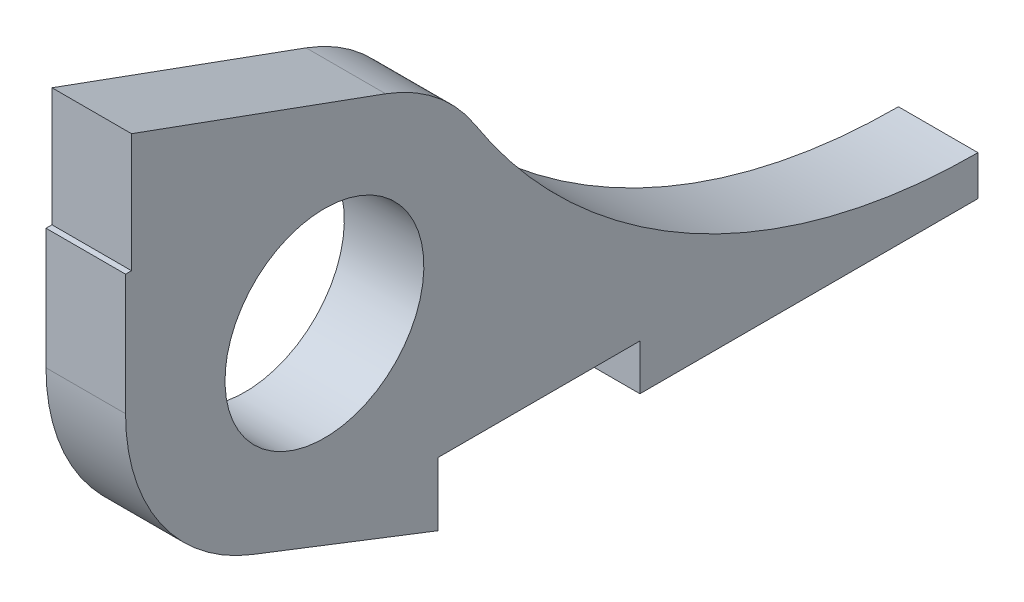
ISO-10303-21;
HEADER;
FILE_DESCRIPTION(('STEP AP214'),'2;1');
FILE_NAME('part.step','',(''),(''),'','','');
FILE_SCHEMA(('AUTOMOTIVE_DESIGN { 1 0 10303 214 1 1 1 1 }'));
ENDSEC;
DATA;
#1=APPLICATION_CONTEXT('core data for automotive mechanical design processes');
#2=APPLICATION_PROTOCOL_DEFINITION('international standard','automotive_design',2000,#1);
#3=PRODUCT_CONTEXT('',#1,'mechanical');
#4=PRODUCT('Part','Part','',(#3));
#5=PRODUCT_RELATED_PRODUCT_CATEGORY('part','',(#4));
#6=PRODUCT_DEFINITION_FORMATION('','',#4);
#7=PRODUCT_DEFINITION_CONTEXT('part definition',#1,'design');
#8=PRODUCT_DEFINITION('design','',#6,#7);
#9=PRODUCT_DEFINITION_SHAPE('','',#8);
#10=(LENGTH_UNIT() NAMED_UNIT(*) SI_UNIT(.MILLI.,.METRE.));
#11=(NAMED_UNIT(*) PLANE_ANGLE_UNIT() SI_UNIT($,.RADIAN.));
#12=(NAMED_UNIT(*) SI_UNIT($,.STERADIAN.) SOLID_ANGLE_UNIT());
#13=UNCERTAINTY_MEASURE_WITH_UNIT(LENGTH_MEASURE(1.E-05),#10,'distance_accuracy_value','');
#14=(GEOMETRIC_REPRESENTATION_CONTEXT(3) GLOBAL_UNCERTAINTY_ASSIGNED_CONTEXT((#13)) GLOBAL_UNIT_ASSIGNED_CONTEXT((#10,
#11,#12)) REPRESENTATION_CONTEXT('',''));
#15=CARTESIAN_POINT('',(0.,0.,0.));
#16=DIRECTION('',(0.,0.,1.));
#17=DIRECTION('',(1.,0.,0.));
#18=AXIS2_PLACEMENT_3D('',#15,#16,#17);
#19=CARTESIAN_POINT('',(195.3,3.3,-14.8633534503092));
#20=DIRECTION('',(0.,0.,-1.));
#21=DIRECTION('',(-1.,0.,0.));
#22=AXIS2_PLACEMENT_3D('',#19,#20,#21);
#23=PLANE('',#22);
#24=DIRECTION('',(0.,-1.,0.));
#25=VECTOR('',#24,1.);
#26=CARTESIAN_POINT('',(195.3,3.3,-14.8633534503092));
#27=LINE('',#26,#25);
#28=CARTESIAN_POINT('',(195.3,3.00000000000068,-14.8633534503092));
#29=VERTEX_POINT('',#28);
#30=CARTESIAN_POINT('',(195.3,1.,-14.8633534503092));
#31=VERTEX_POINT('',#30);
#32=EDGE_CURVE('E149',#29,#31,#27,.T.);
#33=ORIENTED_EDGE('',*,*,#32,.T.);
#34=DIRECTION('',(1.,0.,0.));
#35=VECTOR('',#34,1.);
#36=CARTESIAN_POINT('',(191.3,1.,-14.8633534503092));
#37=LINE('',#36,#35);
#38=CARTESIAN_POINT('',(191.3,1.,-14.8633534503092));
#39=VERTEX_POINT('',#38);
#40=EDGE_CURVE('E138',#39,#31,#37,.T.);
#41=ORIENTED_EDGE('',*,*,#40,.F.);
#42=DIRECTION('',(0.,-1.,0.));
#43=VECTOR('',#42,1.);
#44=CARTESIAN_POINT('',(191.3,3.3,-14.8633534503092));
#45=LINE('',#44,#43);
#46=CARTESIAN_POINT('',(191.3,3.00000000000067,-14.8633534503092));
#47=VERTEX_POINT('',#46);
#48=EDGE_CURVE('E146',#47,#39,#45,.T.);
#49=ORIENTED_EDGE('',*,*,#48,.F.);
#50=DIRECTION('',(1.,0.,0.));
#51=VECTOR('',#50,1.);
#52=CARTESIAN_POINT('',(191.3,3.00000000000067,-14.8633534503092));
#53=LINE('',#52,#51);
#54=EDGE_CURVE('E168',#47,#29,#53,.T.);
#55=ORIENTED_EDGE('',*,*,#54,.T.);
#56=EDGE_LOOP('',(#33,#41,#49,#55));
#57=FACE_BOUND('',#56,.T.);
#58=ADVANCED_FACE('F35',(#57),#23,.T.);
#59=CARTESIAN_POINT('',(195.3,3.3,2.13664654969081));
#60=DIRECTION('',(0.,0.,1.));
#61=DIRECTION('',(1.,0.,0.));
#62=AXIS2_PLACEMENT_3D('',#59,#60,#61);
#63=PLANE('',#62);
#64=DIRECTION('',(0.,-1.,0.));
#65=VECTOR('',#64,1.);
#66=CARTESIAN_POINT('',(191.3,3.3,2.13664654969081));
#67=LINE('',#66,#65);
#68=CARTESIAN_POINT('',(191.3,3.3,2.13664654969081));
#69=VERTEX_POINT('',#68);
#70=CARTESIAN_POINT('',(191.3,0.999999999999999,2.13664654969081));
#71=VERTEX_POINT('',#70);
#72=EDGE_CURVE('E165',#69,#71,#67,.T.);
#73=ORIENTED_EDGE('',*,*,#72,.T.);
#74=DIRECTION('',(-1.,0.,0.));
#75=VECTOR('',#74,1.);
#76=CARTESIAN_POINT('',(195.3,1.,2.13664654969081));
#77=LINE('',#76,#75);
#78=CARTESIAN_POINT('',(195.3,1.,2.13664654969081));
#79=VERTEX_POINT('',#78);
#80=EDGE_CURVE('E51',#79,#71,#77,.T.);
#81=ORIENTED_EDGE('',*,*,#80,.F.);
#82=DIRECTION('',(0.,-1.,0.));
#83=VECTOR('',#82,1.);
#84=CARTESIAN_POINT('',(195.3,3.3,2.13664654969081));
#85=LINE('',#84,#83);
#86=CARTESIAN_POINT('',(195.3,3.3,2.13664654969081));
#87=VERTEX_POINT('',#86);
#88=EDGE_CURVE('E201',#87,#79,#85,.T.);
#89=ORIENTED_EDGE('',*,*,#88,.F.);
#90=DIRECTION('',(-1.,0.,0.));
#91=VECTOR('',#90,1.);
#92=CARTESIAN_POINT('',(195.3,3.3,2.13664654969081));
#93=LINE('',#92,#91);
#94=EDGE_CURVE('E170',#87,#69,#93,.T.);
#95=ORIENTED_EDGE('',*,*,#94,.T.);
#96=EDGE_LOOP('',(#73,#81,#89,#95));
#97=FACE_BOUND('',#96,.T.);
#98=ADVANCED_FACE('F247',(#97),#63,.T.);
#99=CARTESIAN_POINT('',(195.3,13.0641777724765,18.0000000000002));
#100=DIRECTION('',(-1.,0.,0.));
#101=DIRECTION('',(0.,-1.,0.));
#102=AXIS2_PLACEMENT_3D('',#99,#100,#101);
#103=PLANE('',#102);
#104=CARTESIAN_POINT('',(195.3,12.0000000000007,18.));
#105=DIRECTION('',(1.,0.,0.));
#106=DIRECTION('',(0.,1.,0.));
#107=AXIS2_PLACEMENT_3D('',#104,#105,#106);
#108=CIRCLE('',#107,5.);
#109=CARTESIAN_POINT('',(195.3,17.0000000000007,18.));
#110=VERTEX_POINT('',#109);
#111=EDGE_CURVE('E217',#110,#110,#108,.T.);
#112=ORIENTED_EDGE('',*,*,#111,.F.);
#113=EDGE_LOOP('',(#112));
#114=FACE_BOUND('',#113,.T.);
#115=DIRECTION('',(0.,0.,1.));
#116=VECTOR('',#115,1.);
#117=CARTESIAN_POINT('',(195.3,1.,-14.8633534503092));
#118=LINE('',#117,#116);
#119=EDGE_CURVE('E150',#31,#79,#118,.T.);
#120=ORIENTED_EDGE('',*,*,#119,.F.);
#121=ORIENTED_EDGE('',*,*,#32,.F.);
#122=CARTESIAN_POINT('',(195.3,33.0000000000007,-14.8633534503092));
#123=DIRECTION('',(-1.,0.,0.));
#124=DIRECTION('',(0.,-1.,0.));
#125=AXIS2_PLACEMENT_3D('',#122,#123,#124);
#126=CIRCLE('',#125,30.);
#127=CARTESIAN_POINT('',(195.3,16.8461538461543,10.4161492037752));
#128=VERTEX_POINT('',#127);
#129=EDGE_CURVE('E194',#29,#128,#126,.T.);
#130=ORIENTED_EDGE('',*,*,#129,.T.);
#131=CARTESIAN_POINT('',(195.3,12.0000000000007,18.));
#132=DIRECTION('',(1.,0.,0.));
#133=DIRECTION('',(0.,-1.,0.));
#134=AXIS2_PLACEMENT_3D('',#131,#132,#133);
#135=CIRCLE('',#134,8.99999999999937);
#136=CARTESIAN_POINT('',(195.3,20.4572335870737,14.9218187100705));
#137=VERTEX_POINT('',#136);
#138=EDGE_CURVE('E188',#128,#137,#135,.T.);
#139=ORIENTED_EDGE('',*,*,#138,.T.);
#140=DIRECTION('',(0.,0.342020143325529,0.939692620785959));
#141=VECTOR('',#140,1.);
#142=CARTESIAN_POINT('',(195.3,25.217302294943,28.));
#143=LINE('',#142,#141);
#144=CARTESIAN_POINT('',(195.3,25.1081112246632,27.7));
#145=VERTEX_POINT('',#144);
#146=EDGE_CURVE('E186',#137,#145,#143,.T.);
#147=ORIENTED_EDGE('',*,*,#146,.T.);
#148=DIRECTION('',(0.,1.,0.));
#149=VECTOR('',#148,1.);
#150=CARTESIAN_POINT('',(195.3,13.0641777724765,27.7));
#151=LINE('',#150,#149);
#152=CARTESIAN_POINT('',(195.3,19.1407400337098,27.7));
#153=VERTEX_POINT('',#152);
#154=EDGE_CURVE('E80',#153,#145,#151,.T.);
#155=ORIENTED_EDGE('',*,*,#154,.F.);
#156=DIRECTION('',(0.,0.,1.));
#157=VECTOR('',#156,1.);
#158=CARTESIAN_POINT('',(195.3,19.1407400337098,18.0000000000002));
#159=LINE('',#158,#157);
#160=CARTESIAN_POINT('',(195.3,19.1407400337098,28.));
#161=VERTEX_POINT('',#160);
#162=EDGE_CURVE('E59',#153,#161,#159,.T.);
#163=ORIENTED_EDGE('',*,*,#162,.T.);
#164=DIRECTION('',(0.,-1.,0.));
#165=VECTOR('',#164,1.);
#166=CARTESIAN_POINT('',(195.3,13.0641777724765,28.));
#167=LINE('',#166,#165);
#168=CARTESIAN_POINT('',(195.3,13.0641777724765,28.));
#169=VERTEX_POINT('',#168);
#170=EDGE_CURVE('E39',#161,#169,#167,.T.);
#171=ORIENTED_EDGE('',*,*,#170,.T.);
#172=CARTESIAN_POINT('',(195.3,13.0641777724765,18.0000000000002));
#173=DIRECTION('',(1.,0.,0.));
#174=DIRECTION('',(0.,-1.,0.));
#175=AXIS2_PLACEMENT_3D('',#172,#173,#174);
#176=CIRCLE('',#175,9.99999999999986);
#177=CARTESIAN_POINT('',(195.3,3.74455125452248,21.6255429339405));
#178=VERTEX_POINT('',#177);
#179=EDGE_CURVE('E197',#169,#178,#176,.T.);
#180=ORIENTED_EDGE('',*,*,#179,.T.);
#181=DIRECTION('',(0.,-0.362554293394039,-0.931962651795419));
#182=VECTOR('',#181,1.);
#183=CARTESIAN_POINT('',(195.3,-1.61306437854552E-13,12.));
#184=LINE('',#183,#182);
#185=CARTESIAN_POINT('',(195.3,0.116706702579252,12.3));
#186=VERTEX_POINT('',#185);
#187=EDGE_CURVE('E220',#178,#186,#184,.T.);
#188=ORIENTED_EDGE('',*,*,#187,.T.);
#189=DIRECTION('',(0.,-1.,0.));
#190=VECTOR('',#189,1.);
#191=CARTESIAN_POINT('',(195.3,13.0641777724765,12.3));
#192=LINE('',#191,#190);
#193=CARTESIAN_POINT('',(195.3,3.3,12.3));
#194=VERTEX_POINT('',#193);
#195=EDGE_CURVE('E237',#194,#186,#192,.T.);
#196=ORIENTED_EDGE('',*,*,#195,.F.);
#197=DIRECTION('',(0.,0.,1.));
#198=VECTOR('',#197,1.);
#199=CARTESIAN_POINT('',(195.3,3.3,18.0000000000002));
#200=LINE('',#199,#198);
#201=EDGE_CURVE('E169',#87,#194,#200,.T.);
#202=ORIENTED_EDGE('',*,*,#201,.F.);
#203=ORIENTED_EDGE('',*,*,#88,.T.);
#204=EDGE_LOOP('',(#120,#121,#130,#139,#147,#155,#163,#171,#180,#188,#196,#202,#203));
#205=FACE_BOUND('',#204,.T.);
#206=ADVANCED_FACE('F183',(#114,#205),#103,.F.);
#207=CARTESIAN_POINT('',(191.3,13.0641777724765,18.0000000000002));
#208=DIRECTION('',(-1.,0.,0.));
#209=DIRECTION('',(0.,-1.,0.));
#210=AXIS2_PLACEMENT_3D('',#207,#208,#209);
#211=PLANE('',#210);
#212=CARTESIAN_POINT('',(191.3,12.0000000000007,18.));
#213=DIRECTION('',(1.,0.,0.));
#214=DIRECTION('',(0.,1.,0.));
#215=AXIS2_PLACEMENT_3D('',#212,#213,#214);
#216=CIRCLE('',#215,5.);
#217=CARTESIAN_POINT('',(191.3,17.0000000000007,18.));
#218=VERTEX_POINT('',#217);
#219=EDGE_CURVE('E156',#218,#218,#216,.T.);
#220=ORIENTED_EDGE('',*,*,#219,.T.);
#221=EDGE_LOOP('',(#220));
#222=FACE_BOUND('',#221,.T.);
#223=ORIENTED_EDGE('',*,*,#48,.T.);
#224=DIRECTION('',(0.,0.,-1.));
#225=VECTOR('',#224,1.);
#226=CARTESIAN_POINT('',(191.3,1.,2.13664654969081));
#227=LINE('',#226,#225);
#228=EDGE_CURVE('E135',#71,#39,#227,.T.);
#229=ORIENTED_EDGE('',*,*,#228,.F.);
#230=ORIENTED_EDGE('',*,*,#72,.F.);
#231=DIRECTION('',(0.,0.,1.));
#232=VECTOR('',#231,1.);
#233=CARTESIAN_POINT('',(191.3,3.3,18.0000000000002));
#234=LINE('',#233,#232);
#235=CARTESIAN_POINT('',(191.3,3.3,12.3));
#236=VERTEX_POINT('',#235);
#237=EDGE_CURVE('E155',#69,#236,#234,.T.);
#238=ORIENTED_EDGE('',*,*,#237,.T.);
#239=DIRECTION('',(0.,-1.,0.));
#240=VECTOR('',#239,1.);
#241=CARTESIAN_POINT('',(191.3,13.0641777724765,12.3));
#242=LINE('',#241,#240);
#243=CARTESIAN_POINT('',(191.3,0.116706702579238,12.3));
#244=VERTEX_POINT('',#243);
#245=EDGE_CURVE('E161',#236,#244,#242,.T.);
#246=ORIENTED_EDGE('',*,*,#245,.T.);
#247=DIRECTION('',(0.,-0.362554293394039,-0.931962651795419));
#248=VECTOR('',#247,1.);
#249=CARTESIAN_POINT('',(191.3,-1.75272363209925E-13,12.));
#250=LINE('',#249,#248);
#251=CARTESIAN_POINT('',(191.3,3.74455125452247,21.6255429339405));
#252=VERTEX_POINT('',#251);
#253=EDGE_CURVE('E202',#252,#244,#250,.T.);
#254=ORIENTED_EDGE('',*,*,#253,.F.);
#255=CARTESIAN_POINT('',(191.3,13.0641777724765,18.0000000000002));
#256=DIRECTION('',(1.,0.,0.));
#257=DIRECTION('',(0.,-1.,0.));
#258=AXIS2_PLACEMENT_3D('',#255,#256,#257);
#259=CIRCLE('',#258,9.99999999999986);
#260=CARTESIAN_POINT('',(191.3,13.0641777724765,28.));
#261=VERTEX_POINT('',#260);
#262=EDGE_CURVE('E205',#261,#252,#259,.T.);
#263=ORIENTED_EDGE('',*,*,#262,.F.);
#264=DIRECTION('',(0.,-1.,0.));
#265=VECTOR('',#264,1.);
#266=CARTESIAN_POINT('',(191.3,13.0641777724765,28.));
#267=LINE('',#266,#265);
#268=CARTESIAN_POINT('',(191.3,19.1407400337098,28.));
#269=VERTEX_POINT('',#268);
#270=EDGE_CURVE('E190',#269,#261,#267,.T.);
#271=ORIENTED_EDGE('',*,*,#270,.F.);
#272=DIRECTION('',(0.,0.,1.));
#273=VECTOR('',#272,1.);
#274=CARTESIAN_POINT('',(191.3,19.1407400337098,27.7));
#275=LINE('',#274,#273);
#276=CARTESIAN_POINT('',(191.3,19.1407400337098,27.7));
#277=VERTEX_POINT('',#276);
#278=EDGE_CURVE('E44',#277,#269,#275,.T.);
#279=ORIENTED_EDGE('',*,*,#278,.F.);
#280=DIRECTION('',(0.,-1.,0.));
#281=VECTOR('',#280,1.);
#282=CARTESIAN_POINT('',(191.3,25.217302294943,27.7));
#283=LINE('',#282,#281);
#284=CARTESIAN_POINT('',(191.3,25.1081112246632,27.7));
#285=VERTEX_POINT('',#284);
#286=EDGE_CURVE('E71',#285,#277,#283,.T.);
#287=ORIENTED_EDGE('',*,*,#286,.F.);
#288=DIRECTION('',(0.,0.342020143325529,0.939692620785959));
#289=VECTOR('',#288,1.);
#290=CARTESIAN_POINT('',(191.3,25.217302294943,28.));
#291=LINE('',#290,#289);
#292=CARTESIAN_POINT('',(191.3,20.4572335870737,14.9218187100705));
#293=VERTEX_POINT('',#292);
#294=EDGE_CURVE('E158',#293,#285,#291,.T.);
#295=ORIENTED_EDGE('',*,*,#294,.F.);
#296=CARTESIAN_POINT('',(191.3,12.0000000000007,18.));
#297=DIRECTION('',(1.,0.,0.));
#298=DIRECTION('',(0.,-1.,0.));
#299=AXIS2_PLACEMENT_3D('',#296,#297,#298);
#300=CIRCLE('',#299,8.99999999999937);
#301=CARTESIAN_POINT('',(191.3,16.8461538461543,10.4161492037752));
#302=VERTEX_POINT('',#301);
#303=EDGE_CURVE('E211',#302,#293,#300,.T.);
#304=ORIENTED_EDGE('',*,*,#303,.F.);
#305=CARTESIAN_POINT('',(191.3,33.0000000000007,-14.8633534503092));
#306=DIRECTION('',(-1.,0.,0.));
#307=DIRECTION('',(0.,-1.,0.));
#308=AXIS2_PLACEMENT_3D('',#305,#306,#307);
#309=CIRCLE('',#308,30.);
#310=EDGE_CURVE('E154',#47,#302,#309,.T.);
#311=ORIENTED_EDGE('',*,*,#310,.F.);
#312=EDGE_LOOP('',(#223,#229,#230,#238,#246,#254,#263,#271,#279,#287,#295,#304,#311));
#313=FACE_BOUND('',#312,.T.);
#314=ADVANCED_FACE('F37',(#222,#313),#211,.T.);
#315=CARTESIAN_POINT('',(191.3,13.0641777724765,28.));
#316=DIRECTION('',(0.,0.,1.));
#317=DIRECTION('',(1.,0.,0.));
#318=AXIS2_PLACEMENT_3D('',#315,#316,#317);
#319=PLANE('',#318);
#320=ORIENTED_EDGE('',*,*,#170,.F.);
#321=DIRECTION('',(1.,0.,0.));
#322=VECTOR('',#321,1.);
#323=CARTESIAN_POINT('',(240.6,19.1407400337098,28.));
#324=LINE('',#323,#322);
#325=EDGE_CURVE('E11',#269,#161,#324,.T.);
#326=ORIENTED_EDGE('',*,*,#325,.F.);
#327=ORIENTED_EDGE('',*,*,#270,.T.);
#328=DIRECTION('',(1.,0.,0.));
#329=VECTOR('',#328,1.);
#330=CARTESIAN_POINT('',(191.3,13.0641777724765,28.));
#331=LINE('',#330,#329);
#332=EDGE_CURVE('E192',#261,#169,#331,.T.);
#333=ORIENTED_EDGE('',*,*,#332,.T.);
#334=EDGE_LOOP('',(#320,#326,#327,#333));
#335=FACE_BOUND('',#334,.T.);
#336=ADVANCED_FACE('F268',(#335),#319,.T.);
#337=CARTESIAN_POINT('',(191.3,19.1407400337098,27.7));
#338=DIRECTION('',(0.,-1.,0.));
#339=DIRECTION('',(1.,0.,0.));
#340=AXIS2_PLACEMENT_3D('',#337,#338,#339);
#341=PLANE('',#340);
#342=DIRECTION('',(1.,0.,0.));
#343=VECTOR('',#342,1.);
#344=CARTESIAN_POINT('',(191.3,19.1407400337098,27.7));
#345=LINE('',#344,#343);
#346=EDGE_CURVE('E177',#277,#153,#345,.T.);
#347=ORIENTED_EDGE('',*,*,#346,.F.);
#348=ORIENTED_EDGE('',*,*,#278,.T.);
#349=ORIENTED_EDGE('',*,*,#325,.T.);
#350=ORIENTED_EDGE('',*,*,#162,.F.);
#351=EDGE_LOOP('',(#347,#348,#349,#350));
#352=FACE_BOUND('',#351,.T.);
#353=ADVANCED_FACE('F269',(#352),#341,.F.);
#354=CARTESIAN_POINT('',(0.,0.,27.7));
#355=DIRECTION('',(0.,0.,1.));
#356=DIRECTION('',(1.,0.,0.));
#357=AXIS2_PLACEMENT_3D('',#354,#355,#356);
#358=PLANE('',#357);
#359=ORIENTED_EDGE('',*,*,#154,.T.);
#360=DIRECTION('',(1.,0.,0.));
#361=VECTOR('',#360,1.);
#362=CARTESIAN_POINT('',(191.3,25.1081112246632,27.7));
#363=LINE('',#362,#361);
#364=EDGE_CURVE('E77',#285,#145,#363,.T.);
#365=ORIENTED_EDGE('',*,*,#364,.F.);
#366=ORIENTED_EDGE('',*,*,#286,.T.);
#367=ORIENTED_EDGE('',*,*,#346,.T.);
#368=EDGE_LOOP('',(#359,#365,#366,#367));
#369=FACE_BOUND('',#368,.T.);
#370=ADVANCED_FACE('F179',(#369),#358,.T.);
#371=CARTESIAN_POINT('',(191.3,25.217302294943,28.));
#372=DIRECTION('',(0.,0.939692620785959,-0.342020143325529));
#373=DIRECTION('',(0.,0.342020143325529,0.939692620785959));
#374=AXIS2_PLACEMENT_3D('',#371,#372,#373);
#375=PLANE('',#374);
#376=ORIENTED_EDGE('',*,*,#294,.T.);
#377=ORIENTED_EDGE('',*,*,#364,.T.);
#378=ORIENTED_EDGE('',*,*,#146,.F.);
#379=DIRECTION('',(1.,0.,0.));
#380=VECTOR('',#379,1.);
#381=CARTESIAN_POINT('',(191.3,20.4572335870737,14.9218187100705));
#382=LINE('',#381,#380);
#383=EDGE_CURVE('E214',#293,#137,#382,.T.);
#384=ORIENTED_EDGE('',*,*,#383,.F.);
#385=EDGE_LOOP('',(#376,#377,#378,#384));
#386=FACE_BOUND('',#385,.T.);
#387=ADVANCED_FACE('F276',(#386),#375,.T.);
#388=CARTESIAN_POINT('',(191.3,12.0000000000007,18.));
#389=DIRECTION('',(1.,0.,0.));
#390=DIRECTION('',(0.,1.,0.));
#391=AXIS2_PLACEMENT_3D('',#388,#389,#390);
#392=CYLINDRICAL_SURFACE('',#391,8.99999999999937);
#393=ORIENTED_EDGE('',*,*,#138,.F.);
#394=DIRECTION('',(1.,0.,0.));
#395=VECTOR('',#394,1.);
#396=CARTESIAN_POINT('',(191.3,16.8461538461543,10.4161492037752));
#397=LINE('',#396,#395);
#398=EDGE_CURVE('E216',#302,#128,#397,.T.);
#399=ORIENTED_EDGE('',*,*,#398,.F.);
#400=ORIENTED_EDGE('',*,*,#303,.T.);
#401=ORIENTED_EDGE('',*,*,#383,.T.);
#402=EDGE_LOOP('',(#393,#399,#400,#401));
#403=FACE_BOUND('',#402,.T.);
#404=ADVANCED_FACE('F301',(#403),#392,.T.);
#405=CARTESIAN_POINT('',(191.3,33.0000000000007,-14.8633534503092));
#406=DIRECTION('',(1.,0.,0.));
#407=DIRECTION('',(0.,1.,0.));
#408=AXIS2_PLACEMENT_3D('',#405,#406,#407);
#409=CYLINDRICAL_SURFACE('',#408,30.);
#410=ORIENTED_EDGE('',*,*,#129,.F.);
#411=ORIENTED_EDGE('',*,*,#54,.F.);
#412=ORIENTED_EDGE('',*,*,#310,.T.);
#413=ORIENTED_EDGE('',*,*,#398,.T.);
#414=EDGE_LOOP('',(#410,#411,#412,#413));
#415=FACE_BOUND('',#414,.T.);
#416=ADVANCED_FACE('F290',(#415),#409,.F.);
#417=CARTESIAN_POINT('',(191.3,12.0000000000007,18.));
#418=DIRECTION('',(1.,0.,0.));
#419=DIRECTION('',(0.,1.,0.));
#420=AXIS2_PLACEMENT_3D('',#417,#418,#419);
#421=CYLINDRICAL_SURFACE('',#420,5.);
#422=ORIENTED_EDGE('',*,*,#219,.F.);
#423=EDGE_LOOP('',(#422));
#424=FACE_BOUND('',#423,.T.);
#425=ORIENTED_EDGE('',*,*,#111,.T.);
#426=EDGE_LOOP('',(#425));
#427=FACE_BOUND('',#426,.T.);
#428=ADVANCED_FACE('F287',(#424,#427),#421,.F.);
#429=CARTESIAN_POINT('',(191.3,13.0641777724765,18.0000000000002));
#430=DIRECTION('',(1.,0.,0.));
#431=DIRECTION('',(0.,1.,0.));
#432=AXIS2_PLACEMENT_3D('',#429,#430,#431);
#433=CYLINDRICAL_SURFACE('',#432,9.99999999999986);
#434=ORIENTED_EDGE('',*,*,#179,.F.);
#435=ORIENTED_EDGE('',*,*,#332,.F.);
#436=ORIENTED_EDGE('',*,*,#262,.T.);
#437=DIRECTION('',(1.,0.,0.));
#438=VECTOR('',#437,1.);
#439=CARTESIAN_POINT('',(191.3,3.74455125452247,21.6255429339405));
#440=LINE('',#439,#438);
#441=EDGE_CURVE('E207',#252,#178,#440,.T.);
#442=ORIENTED_EDGE('',*,*,#441,.T.);
#443=EDGE_LOOP('',(#434,#435,#436,#442));
#444=FACE_BOUND('',#443,.T.);
#445=ADVANCED_FACE('F262',(#444),#433,.T.);
#446=CARTESIAN_POINT('',(191.3,-1.75272363209925E-13,12.));
#447=DIRECTION('',(0.,-0.931962651795419,0.362554293394039));
#448=DIRECTION('',(0.,-0.362554293394039,-0.931962651795419));
#449=AXIS2_PLACEMENT_3D('',#446,#447,#448);
#450=PLANE('',#449);
#451=ORIENTED_EDGE('',*,*,#253,.T.);
#452=DIRECTION('',(1.,0.,0.));
#453=VECTOR('',#452,1.);
#454=CARTESIAN_POINT('',(191.3,0.116706702579238,12.3));
#455=LINE('',#454,#453);
#456=EDGE_CURVE('E239',#244,#186,#455,.T.);
#457=ORIENTED_EDGE('',*,*,#456,.T.);
#458=ORIENTED_EDGE('',*,*,#187,.F.);
#459=ORIENTED_EDGE('',*,*,#441,.F.);
#460=EDGE_LOOP('',(#451,#457,#458,#459));
#461=FACE_BOUND('',#460,.T.);
#462=ADVANCED_FACE('F259',(#461),#450,.T.);
#463=CARTESIAN_POINT('',(0.,3.3,0.));
#464=DIRECTION('',(0.,-1.,0.));
#465=DIRECTION('',(0.,0.,-1.));
#466=AXIS2_PLACEMENT_3D('',#463,#464,#465);
#467=PLANE('',#466);
#468=ORIENTED_EDGE('',*,*,#94,.F.);
#469=ORIENTED_EDGE('',*,*,#201,.T.);
#470=DIRECTION('',(-1.,0.,0.));
#471=VECTOR('',#470,1.);
#472=CARTESIAN_POINT('',(190.698838390034,3.3,12.3));
#473=LINE('',#472,#471);
#474=EDGE_CURVE('E242',#194,#236,#473,.T.);
#475=ORIENTED_EDGE('',*,*,#474,.T.);
#476=ORIENTED_EDGE('',*,*,#237,.F.);
#477=EDGE_LOOP('',(#468,#469,#475,#476));
#478=FACE_BOUND('',#477,.T.);
#479=ADVANCED_FACE('F252',(#478),#467,.T.);
#480=CARTESIAN_POINT('',(0.,0.,12.3));
#481=DIRECTION('',(0.,0.,-1.));
#482=DIRECTION('',(-1.,0.,0.));
#483=AXIS2_PLACEMENT_3D('',#480,#481,#482);
#484=PLANE('',#483);
#485=ORIENTED_EDGE('',*,*,#474,.F.);
#486=ORIENTED_EDGE('',*,*,#195,.T.);
#487=ORIENTED_EDGE('',*,*,#456,.F.);
#488=ORIENTED_EDGE('',*,*,#245,.F.);
#489=EDGE_LOOP('',(#485,#486,#487,#488));
#490=FACE_BOUND('',#489,.T.);
#491=ADVANCED_FACE('F255',(#490),#484,.T.);
#492=CARTESIAN_POINT('',(0.,1.,0.));
#493=DIRECTION('',(0.,-1.,0.));
#494=DIRECTION('',(0.,0.,-1.));
#495=AXIS2_PLACEMENT_3D('',#492,#493,#494);
#496=PLANE('',#495);
#497=ORIENTED_EDGE('',*,*,#228,.T.);
#498=ORIENTED_EDGE('',*,*,#40,.T.);
#499=ORIENTED_EDGE('',*,*,#119,.T.);
#500=ORIENTED_EDGE('',*,*,#80,.T.);
#501=EDGE_LOOP('',(#497,#498,#499,#500));
#502=FACE_BOUND('',#501,.T.);
#503=ADVANCED_FACE('F137',(#502),#496,.T.);
#504=CLOSED_SHELL('',(#58,#98,#206,#314,#336,#353,#370,#387,#404,#416,#428,#445,#462,#479,#491,#503));
#505=MANIFOLD_SOLID_BREP('B2',#504);
#506=ADVANCED_BREP_SHAPE_REPRESENTATION('',(#18,#505),#14);
#507=SHAPE_DEFINITION_REPRESENTATION(#9,#506);
ENDSEC;
END-ISO-10303-21;
